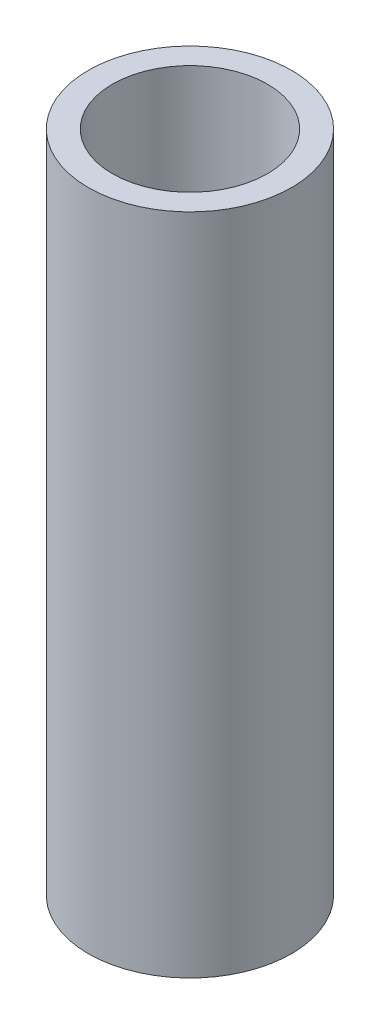
ISO-10303-21;
HEADER;
FILE_DESCRIPTION(('STEP AP214'),'2;1');
FILE_NAME('part.step','',(''),(''),'','','');
FILE_SCHEMA(('AUTOMOTIVE_DESIGN { 1 0 10303 214 1 1 1 1 }'));
ENDSEC;
DATA;
#1=APPLICATION_CONTEXT('core data for automotive mechanical design processes');
#2=APPLICATION_PROTOCOL_DEFINITION('international standard','automotive_design',2000,#1);
#3=PRODUCT_CONTEXT('',#1,'mechanical');
#4=PRODUCT('Part','Part','',(#3));
#5=PRODUCT_RELATED_PRODUCT_CATEGORY('part','',(#4));
#6=PRODUCT_DEFINITION_FORMATION('','',#4);
#7=PRODUCT_DEFINITION_CONTEXT('part definition',#1,'design');
#8=PRODUCT_DEFINITION('design','',#6,#7);
#9=PRODUCT_DEFINITION_SHAPE('','',#8);
#10=(LENGTH_UNIT() NAMED_UNIT(*) SI_UNIT(.MILLI.,.METRE.));
#11=(NAMED_UNIT(*) PLANE_ANGLE_UNIT() SI_UNIT($,.RADIAN.));
#12=(NAMED_UNIT(*) SI_UNIT($,.STERADIAN.) SOLID_ANGLE_UNIT());
#13=UNCERTAINTY_MEASURE_WITH_UNIT(LENGTH_MEASURE(1.E-05),#10,'distance_accuracy_value','');
#14=(GEOMETRIC_REPRESENTATION_CONTEXT(3) GLOBAL_UNCERTAINTY_ASSIGNED_CONTEXT((#13)) GLOBAL_UNIT_ASSIGNED_CONTEXT((#10,
#11,#12)) REPRESENTATION_CONTEXT('',''));
#15=CARTESIAN_POINT('',(0.,0.,0.));
#16=DIRECTION('',(0.,0.,1.));
#17=DIRECTION('',(1.,0.,0.));
#18=AXIS2_PLACEMENT_3D('',#15,#16,#17);
#19=CARTESIAN_POINT('',(0.,22.8092,0.));
#20=DIRECTION('',(0.,1.,0.));
#21=DIRECTION('',(0.,0.,1.));
#22=AXIS2_PLACEMENT_3D('',#19,#20,#21);
#23=PLANE('',#22);
#24=CARTESIAN_POINT('',(0.,22.8092,0.));
#25=DIRECTION('',(0.,1.,0.));
#26=DIRECTION('',(0.,0.,1.));
#27=AXIS2_PLACEMENT_3D('',#24,#25,#26);
#28=CIRCLE('',#27,3.4925);
#29=CARTESIAN_POINT('',(0.,22.8092,3.4925));
#30=VERTEX_POINT('',#29);
#31=EDGE_CURVE('E10',#30,#30,#28,.T.);
#32=ORIENTED_EDGE('',*,*,#31,.T.);
#33=EDGE_LOOP('',(#32));
#34=FACE_BOUND('',#33,.T.);
#35=CARTESIAN_POINT('',(0.,22.8092,0.));
#36=DIRECTION('',(0.,1.,0.));
#37=DIRECTION('',(0.,0.,1.));
#38=AXIS2_PLACEMENT_3D('',#35,#36,#37);
#39=CIRCLE('',#38,2.667);
#40=CARTESIAN_POINT('',(0.,22.8092,2.667));
#41=VERTEX_POINT('',#40);
#42=EDGE_CURVE('E45',#41,#41,#39,.T.);
#43=ORIENTED_EDGE('',*,*,#42,.F.);
#44=EDGE_LOOP('',(#43));
#45=FACE_BOUND('',#44,.T.);
#46=ADVANCED_FACE('F34',(#34,#45),#23,.T.);
#47=CARTESIAN_POINT('',(0.,0.,0.));
#48=DIRECTION('',(0.,1.,0.));
#49=DIRECTION('',(0.,0.,1.));
#50=AXIS2_PLACEMENT_3D('',#47,#48,#49);
#51=PLANE('',#50);
#52=CARTESIAN_POINT('',(0.,0.,0.));
#53=DIRECTION('',(0.,1.,0.));
#54=DIRECTION('',(0.,0.,1.));
#55=AXIS2_PLACEMENT_3D('',#52,#53,#54);
#56=CIRCLE('',#55,3.4925);
#57=CARTESIAN_POINT('',(0.,0.,3.4925));
#58=VERTEX_POINT('',#57);
#59=EDGE_CURVE('E38',#58,#58,#56,.T.);
#60=ORIENTED_EDGE('',*,*,#59,.F.);
#61=EDGE_LOOP('',(#60));
#62=FACE_BOUND('',#61,.T.);
#63=CARTESIAN_POINT('',(0.,0.,0.));
#64=DIRECTION('',(0.,1.,0.));
#65=DIRECTION('',(0.,0.,1.));
#66=AXIS2_PLACEMENT_3D('',#63,#64,#65);
#67=CIRCLE('',#66,2.667);
#68=CARTESIAN_POINT('',(0.,0.,2.667));
#69=VERTEX_POINT('',#68);
#70=EDGE_CURVE('E47',#69,#69,#67,.T.);
#71=ORIENTED_EDGE('',*,*,#70,.T.);
#72=EDGE_LOOP('',(#71));
#73=FACE_BOUND('',#72,.T.);
#74=ADVANCED_FACE('F57',(#62,#73),#51,.F.);
#75=CARTESIAN_POINT('',(0.,22.8092,0.));
#76=DIRECTION('',(0.,-1.,0.));
#77=DIRECTION('',(0.,0.,-1.));
#78=AXIS2_PLACEMENT_3D('',#75,#76,#77);
#79=CYLINDRICAL_SURFACE('',#78,3.4925);
#80=ORIENTED_EDGE('',*,*,#31,.F.);
#81=EDGE_LOOP('',(#80));
#82=FACE_BOUND('',#81,.T.);
#83=ORIENTED_EDGE('',*,*,#59,.T.);
#84=EDGE_LOOP('',(#83));
#85=FACE_BOUND('',#84,.T.);
#86=ADVANCED_FACE('F36',(#82,#85),#79,.T.);
#87=CARTESIAN_POINT('',(0.,22.8092,0.));
#88=DIRECTION('',(0.,-1.,0.));
#89=DIRECTION('',(0.,0.,-1.));
#90=AXIS2_PLACEMENT_3D('',#87,#88,#89);
#91=CYLINDRICAL_SURFACE('',#90,2.667);
#92=ORIENTED_EDGE('',*,*,#42,.T.);
#93=EDGE_LOOP('',(#92));
#94=FACE_BOUND('',#93,.T.);
#95=ORIENTED_EDGE('',*,*,#70,.F.);
#96=EDGE_LOOP('',(#95));
#97=FACE_BOUND('',#96,.T.);
#98=ADVANCED_FACE('F53',(#94,#97),#91,.F.);
#99=CLOSED_SHELL('',(#46,#74,#86,#98));
#100=MANIFOLD_SOLID_BREP('B2',#99);
#101=ADVANCED_BREP_SHAPE_REPRESENTATION('',(#18,#100),#14);
#102=SHAPE_DEFINITION_REPRESENTATION(#9,#101);
ENDSEC;
END-ISO-10303-21;
